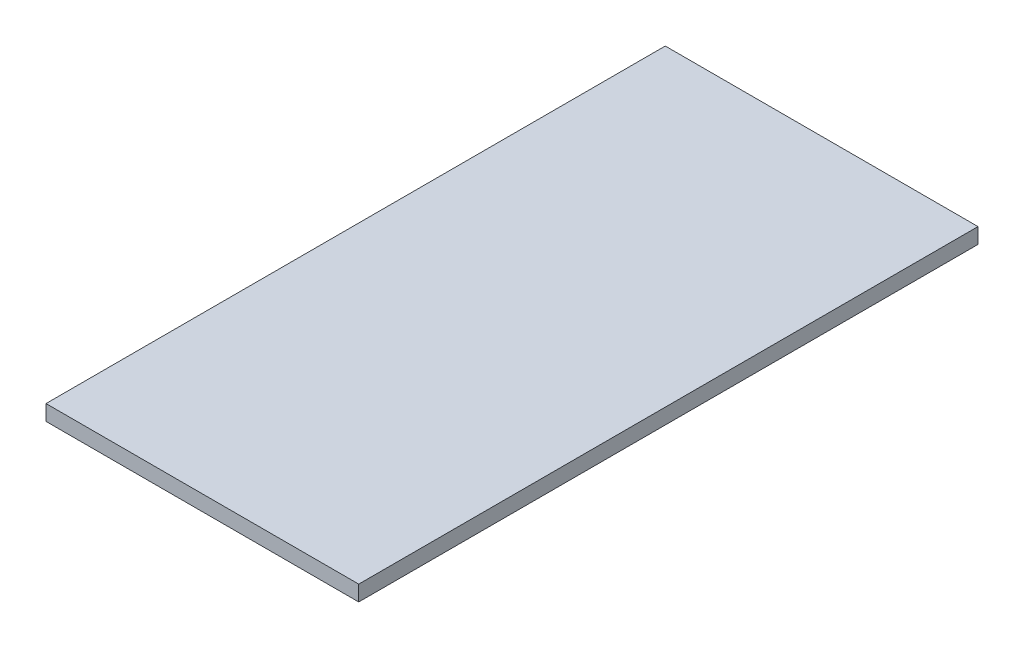
ISO-10303-21;
HEADER;
FILE_DESCRIPTION(('STEP AP214'),'2;1');
FILE_NAME('part.step','',(''),(''),'','','');
FILE_SCHEMA(('AUTOMOTIVE_DESIGN { 1 0 10303 214 1 1 1 1 }'));
ENDSEC;
DATA;
#1=APPLICATION_CONTEXT('core data for automotive mechanical design processes');
#2=APPLICATION_PROTOCOL_DEFINITION('international standard','automotive_design',2000,#1);
#3=PRODUCT_CONTEXT('',#1,'mechanical');
#4=PRODUCT('Part','Part','',(#3));
#5=PRODUCT_RELATED_PRODUCT_CATEGORY('part','',(#4));
#6=PRODUCT_DEFINITION_FORMATION('','',#4);
#7=PRODUCT_DEFINITION_CONTEXT('part definition',#1,'design');
#8=PRODUCT_DEFINITION('design','',#6,#7);
#9=PRODUCT_DEFINITION_SHAPE('','',#8);
#10=(LENGTH_UNIT() NAMED_UNIT(*) SI_UNIT(.MILLI.,.METRE.));
#11=(NAMED_UNIT(*) PLANE_ANGLE_UNIT() SI_UNIT($,.RADIAN.));
#12=(NAMED_UNIT(*) SI_UNIT($,.STERADIAN.) SOLID_ANGLE_UNIT());
#13=UNCERTAINTY_MEASURE_WITH_UNIT(LENGTH_MEASURE(1.E-05),#10,'distance_accuracy_value','');
#14=(GEOMETRIC_REPRESENTATION_CONTEXT(3) GLOBAL_UNCERTAINTY_ASSIGNED_CONTEXT((#13)) GLOBAL_UNIT_ASSIGNED_CONTEXT((#10,
#11,#12)) REPRESENTATION_CONTEXT('',''));
#15=CARTESIAN_POINT('',(0.,0.,0.));
#16=DIRECTION('',(0.,0.,1.));
#17=DIRECTION('',(1.,0.,0.));
#18=AXIS2_PLACEMENT_3D('',#15,#16,#17);
#19=CARTESIAN_POINT('',(50.5,5.,-100.));
#20=DIRECTION('',(-1.,0.,0.));
#21=DIRECTION('',(0.,0.,1.));
#22=AXIS2_PLACEMENT_3D('',#19,#20,#21);
#23=PLANE('',#22);
#24=DIRECTION('',(0.,0.,-1.));
#25=VECTOR('',#24,1.);
#26=CARTESIAN_POINT('',(50.5,0.,-100.));
#27=LINE('',#26,#25);
#28=CARTESIAN_POINT('',(50.5,0.,100.));
#29=VERTEX_POINT('',#28);
#30=CARTESIAN_POINT('',(50.5,0.,-100.));
#31=VERTEX_POINT('',#30);
#32=EDGE_CURVE('E96',#29,#31,#27,.T.);
#33=ORIENTED_EDGE('',*,*,#32,.T.);
#34=DIRECTION('',(0.,-1.,0.));
#35=VECTOR('',#34,1.);
#36=CARTESIAN_POINT('',(50.5,5.,-100.));
#37=LINE('',#36,#35);
#38=CARTESIAN_POINT('',(50.5,5.,-100.));
#39=VERTEX_POINT('',#38);
#40=EDGE_CURVE('E11',#39,#31,#37,.T.);
#41=ORIENTED_EDGE('',*,*,#40,.F.);
#42=DIRECTION('',(0.,0.,-1.));
#43=VECTOR('',#42,1.);
#44=CARTESIAN_POINT('',(50.5,5.,-100.));
#45=LINE('',#44,#43);
#46=CARTESIAN_POINT('',(50.5,5.,100.));
#47=VERTEX_POINT('',#46);
#48=EDGE_CURVE('E84',#47,#39,#45,.T.);
#49=ORIENTED_EDGE('',*,*,#48,.F.);
#50=DIRECTION('',(0.,-1.,0.));
#51=VECTOR('',#50,1.);
#52=CARTESIAN_POINT('',(50.5,5.,100.));
#53=LINE('',#52,#51);
#54=EDGE_CURVE('E92',#47,#29,#53,.T.);
#55=ORIENTED_EDGE('',*,*,#54,.T.);
#56=EDGE_LOOP('',(#33,#41,#49,#55));
#57=FACE_BOUND('',#56,.T.);
#58=ADVANCED_FACE('F33',(#57),#23,.F.);
#59=CARTESIAN_POINT('',(-50.5,5.,-100.));
#60=DIRECTION('',(0.,0.,1.));
#61=DIRECTION('',(1.,0.,0.));
#62=AXIS2_PLACEMENT_3D('',#59,#60,#61);
#63=PLANE('',#62);
#64=DIRECTION('',(-1.,0.,0.));
#65=VECTOR('',#64,1.);
#66=CARTESIAN_POINT('',(-50.5,0.,-100.));
#67=LINE('',#66,#65);
#68=CARTESIAN_POINT('',(-50.5,0.,-100.));
#69=VERTEX_POINT('',#68);
#70=EDGE_CURVE('E88',#31,#69,#67,.T.);
#71=ORIENTED_EDGE('',*,*,#70,.T.);
#72=DIRECTION('',(0.,-1.,0.));
#73=VECTOR('',#72,1.);
#74=CARTESIAN_POINT('',(-50.5,5.,-100.));
#75=LINE('',#74,#73);
#76=CARTESIAN_POINT('',(-50.5,5.,-100.));
#77=VERTEX_POINT('',#76);
#78=EDGE_CURVE('E41',#77,#69,#75,.T.);
#79=ORIENTED_EDGE('',*,*,#78,.F.);
#80=DIRECTION('',(-1.,0.,0.));
#81=VECTOR('',#80,1.);
#82=CARTESIAN_POINT('',(-50.5,5.,-100.));
#83=LINE('',#82,#81);
#84=EDGE_CURVE('E79',#39,#77,#83,.T.);
#85=ORIENTED_EDGE('',*,*,#84,.F.);
#86=ORIENTED_EDGE('',*,*,#40,.T.);
#87=EDGE_LOOP('',(#71,#79,#85,#86));
#88=FACE_BOUND('',#87,.T.);
#89=ADVANCED_FACE('F87',(#88),#63,.F.);
#90=CARTESIAN_POINT('',(-50.5,5.,-100.));
#91=DIRECTION('',(1.,0.,0.));
#92=DIRECTION('',(0.,0.,-1.));
#93=AXIS2_PLACEMENT_3D('',#90,#91,#92);
#94=PLANE('',#93);
#95=DIRECTION('',(0.,0.,1.));
#96=VECTOR('',#95,1.);
#97=CARTESIAN_POINT('',(-50.5,0.,-100.));
#98=LINE('',#97,#96);
#99=CARTESIAN_POINT('',(-50.5,0.,100.));
#100=VERTEX_POINT('',#99);
#101=EDGE_CURVE('E66',#69,#100,#98,.T.);
#102=ORIENTED_EDGE('',*,*,#101,.T.);
#103=DIRECTION('',(0.,-1.,0.));
#104=VECTOR('',#103,1.);
#105=CARTESIAN_POINT('',(-50.5,5.,100.));
#106=LINE('',#105,#104);
#107=CARTESIAN_POINT('',(-50.5,5.,100.));
#108=VERTEX_POINT('',#107);
#109=EDGE_CURVE('E89',#108,#100,#106,.T.);
#110=ORIENTED_EDGE('',*,*,#109,.F.);
#111=DIRECTION('',(0.,0.,1.));
#112=VECTOR('',#111,1.);
#113=CARTESIAN_POINT('',(-50.5,5.,-100.));
#114=LINE('',#113,#112);
#115=EDGE_CURVE('E82',#77,#108,#114,.T.);
#116=ORIENTED_EDGE('',*,*,#115,.F.);
#117=ORIENTED_EDGE('',*,*,#78,.T.);
#118=EDGE_LOOP('',(#102,#110,#116,#117));
#119=FACE_BOUND('',#118,.T.);
#120=ADVANCED_FACE('F90',(#119),#94,.F.);
#121=CARTESIAN_POINT('',(-50.5,5.,100.));
#122=DIRECTION('',(0.,0.,-1.));
#123=DIRECTION('',(-1.,0.,0.));
#124=AXIS2_PLACEMENT_3D('',#121,#122,#123);
#125=PLANE('',#124);
#126=DIRECTION('',(1.,0.,0.));
#127=VECTOR('',#126,1.);
#128=CARTESIAN_POINT('',(-50.5,0.,100.));
#129=LINE('',#128,#127);
#130=EDGE_CURVE('E72',#100,#29,#129,.T.);
#131=ORIENTED_EDGE('',*,*,#130,.T.);
#132=ORIENTED_EDGE('',*,*,#54,.F.);
#133=DIRECTION('',(1.,0.,0.));
#134=VECTOR('',#133,1.);
#135=CARTESIAN_POINT('',(-50.5,5.,100.));
#136=LINE('',#135,#134);
#137=EDGE_CURVE('E49',#108,#47,#136,.T.);
#138=ORIENTED_EDGE('',*,*,#137,.F.);
#139=ORIENTED_EDGE('',*,*,#109,.T.);
#140=EDGE_LOOP('',(#131,#132,#138,#139));
#141=FACE_BOUND('',#140,.T.);
#142=ADVANCED_FACE('F103',(#141),#125,.F.);
#143=CARTESIAN_POINT('',(0.,5.,0.));
#144=DIRECTION('',(0.,1.,0.));
#145=DIRECTION('',(0.,0.,1.));
#146=AXIS2_PLACEMENT_3D('',#143,#144,#145);
#147=PLANE('',#146);
#148=ORIENTED_EDGE('',*,*,#48,.T.);
#149=ORIENTED_EDGE('',*,*,#84,.T.);
#150=ORIENTED_EDGE('',*,*,#115,.T.);
#151=ORIENTED_EDGE('',*,*,#137,.T.);
#152=EDGE_LOOP('',(#148,#149,#150,#151));
#153=FACE_BOUND('',#152,.T.);
#154=ADVANCED_FACE('F80',(#153),#147,.T.);
#155=CARTESIAN_POINT('',(0.,0.,0.));
#156=DIRECTION('',(0.,1.,0.));
#157=DIRECTION('',(0.,0.,1.));
#158=AXIS2_PLACEMENT_3D('',#155,#156,#157);
#159=PLANE('',#158);
#160=ORIENTED_EDGE('',*,*,#32,.F.);
#161=ORIENTED_EDGE('',*,*,#130,.F.);
#162=ORIENTED_EDGE('',*,*,#101,.F.);
#163=ORIENTED_EDGE('',*,*,#70,.F.);
#164=EDGE_LOOP('',(#160,#161,#162,#163));
#165=FACE_BOUND('',#164,.T.);
#166=ADVANCED_FACE('F106',(#165),#159,.F.);
#167=CLOSED_SHELL('',(#58,#89,#120,#142,#154,#166));
#168=MANIFOLD_SOLID_BREP('B2',#167);
#169=ADVANCED_BREP_SHAPE_REPRESENTATION('',(#18,#168),#14);
#170=SHAPE_DEFINITION_REPRESENTATION(#9,#169);
ENDSEC;
END-ISO-10303-21;
